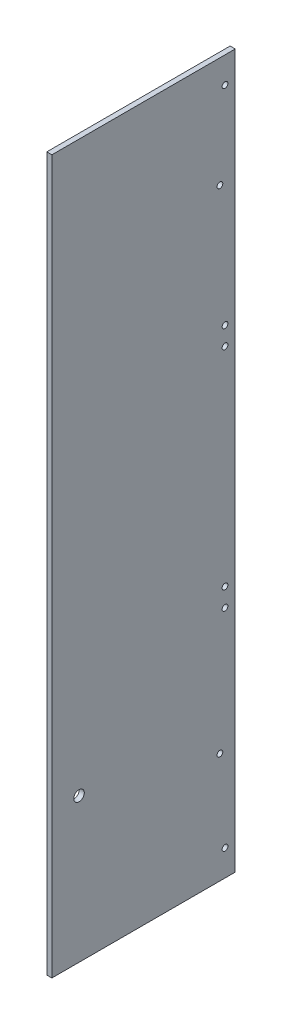
ISO-10303-21;
HEADER;
FILE_DESCRIPTION(('STEP AP214'),'2;1');
FILE_NAME('part.step','',(''),(''),'','','');
FILE_SCHEMA(('AUTOMOTIVE_DESIGN { 1 0 10303 214 1 1 1 1 }'));
ENDSEC;
DATA;
#1=APPLICATION_CONTEXT('core data for automotive mechanical design processes');
#2=APPLICATION_PROTOCOL_DEFINITION('international standard','automotive_design',2000,#1);
#3=PRODUCT_CONTEXT('',#1,'mechanical');
#4=PRODUCT('Part','Part','',(#3));
#5=PRODUCT_RELATED_PRODUCT_CATEGORY('part','',(#4));
#6=PRODUCT_DEFINITION_FORMATION('','',#4);
#7=PRODUCT_DEFINITION_CONTEXT('part definition',#1,'design');
#8=PRODUCT_DEFINITION('design','',#6,#7);
#9=PRODUCT_DEFINITION_SHAPE('','',#8);
#10=(LENGTH_UNIT() NAMED_UNIT(*) SI_UNIT(.MILLI.,.METRE.));
#11=(NAMED_UNIT(*) PLANE_ANGLE_UNIT() SI_UNIT($,.RADIAN.));
#12=(NAMED_UNIT(*) SI_UNIT($,.STERADIAN.) SOLID_ANGLE_UNIT());
#13=UNCERTAINTY_MEASURE_WITH_UNIT(LENGTH_MEASURE(1.E-05),#10,'distance_accuracy_value','');
#14=(GEOMETRIC_REPRESENTATION_CONTEXT(3) GLOBAL_UNCERTAINTY_ASSIGNED_CONTEXT((#13)) GLOBAL_UNIT_ASSIGNED_CONTEXT((#10,
#11,#12)) REPRESENTATION_CONTEXT('',''));
#15=CARTESIAN_POINT('',(0.,0.,0.));
#16=DIRECTION('',(0.,0.,1.));
#17=DIRECTION('',(1.,0.,0.));
#18=AXIS2_PLACEMENT_3D('',#15,#16,#17);
#19=CARTESIAN_POINT('',(0.,0.,108.));
#20=DIRECTION('',(0.,0.,1.));
#21=DIRECTION('',(1.,0.,0.));
#22=AXIS2_PLACEMENT_3D('',#19,#20,#21);
#23=PLANE('',#22);
#24=DIRECTION('',(-1.,0.,0.));
#25=VECTOR('',#24,1.);
#26=CARTESIAN_POINT('',(0.,-210.,108.));
#27=LINE('',#26,#25);
#28=CARTESIAN_POINT('',(1.5,-210.,108.));
#29=VERTEX_POINT('',#28);
#30=CARTESIAN_POINT('',(-1.5,-210.,108.));
#31=VERTEX_POINT('',#30);
#32=EDGE_CURVE('E9',#29,#31,#27,.T.);
#33=ORIENTED_EDGE('',*,*,#32,.F.);
#34=DIRECTION('',(0.,-1.,0.));
#35=VECTOR('',#34,1.);
#36=CARTESIAN_POINT('',(1.5,0.,108.));
#37=LINE('',#36,#35);
#38=CARTESIAN_POINT('',(1.5,210.,108.));
#39=VERTEX_POINT('',#38);
#40=EDGE_CURVE('E61',#39,#29,#37,.T.);
#41=ORIENTED_EDGE('',*,*,#40,.F.);
#42=DIRECTION('',(1.,0.,0.));
#43=VECTOR('',#42,1.);
#44=CARTESIAN_POINT('',(0.,210.,108.));
#45=LINE('',#44,#43);
#46=CARTESIAN_POINT('',(-1.5,210.,108.));
#47=VERTEX_POINT('',#46);
#48=EDGE_CURVE('E89',#47,#39,#45,.T.);
#49=ORIENTED_EDGE('',*,*,#48,.F.);
#50=DIRECTION('',(0.,1.,0.));
#51=VECTOR('',#50,1.);
#52=CARTESIAN_POINT('',(-1.5,0.,108.));
#53=LINE('',#52,#51);
#54=EDGE_CURVE('E23',#31,#47,#53,.T.);
#55=ORIENTED_EDGE('',*,*,#54,.F.);
#56=EDGE_LOOP('',(#33,#41,#49,#55));
#57=FACE_BOUND('',#56,.T.);
#58=ADVANCED_FACE('F15',(#57),#23,.T.);
#59=CARTESIAN_POINT('',(0.,-210.,0.));
#60=DIRECTION('',(0.,-1.,0.));
#61=DIRECTION('',(0.,0.,-1.));
#62=AXIS2_PLACEMENT_3D('',#59,#60,#61);
#63=PLANE('',#62);
#64=DIRECTION('',(0.,0.,1.));
#65=VECTOR('',#64,1.);
#66=CARTESIAN_POINT('',(1.5,-210.,0.));
#67=LINE('',#66,#65);
#68=CARTESIAN_POINT('',(1.5,-210.,0.));
#69=VERTEX_POINT('',#68);
#70=EDGE_CURVE('E54',#69,#29,#67,.T.);
#71=ORIENTED_EDGE('',*,*,#70,.T.);
#72=ORIENTED_EDGE('',*,*,#32,.T.);
#73=DIRECTION('',(0.,0.,1.));
#74=VECTOR('',#73,1.);
#75=CARTESIAN_POINT('',(-1.5,-210.,0.));
#76=LINE('',#75,#74);
#77=CARTESIAN_POINT('',(-1.5,-210.,0.));
#78=VERTEX_POINT('',#77);
#79=EDGE_CURVE('E67',#78,#31,#76,.T.);
#80=ORIENTED_EDGE('',*,*,#79,.F.);
#81=DIRECTION('',(1.,0.,0.));
#82=VECTOR('',#81,1.);
#83=CARTESIAN_POINT('',(0.,-210.,0.));
#84=LINE('',#83,#82);
#85=EDGE_CURVE('E65',#78,#69,#84,.T.);
#86=ORIENTED_EDGE('',*,*,#85,.T.);
#87=EDGE_LOOP('',(#71,#72,#80,#86));
#88=FACE_BOUND('',#87,.T.);
#89=ADVANCED_FACE('F66',(#88),#63,.T.);
#90=CARTESIAN_POINT('',(-1.5,0.,0.));
#91=DIRECTION('',(-1.,0.,0.));
#92=DIRECTION('',(0.,0.,1.));
#93=AXIS2_PLACEMENT_3D('',#90,#91,#92);
#94=PLANE('',#93);
#95=CARTESIAN_POINT('',(-1.5,-125.,92.));
#96=DIRECTION('',(-1.,0.,0.));
#97=DIRECTION('',(0.,0.,1.));
#98=AXIS2_PLACEMENT_3D('',#95,#96,#97);
#99=CIRCLE('',#98,3.1);
#100=CARTESIAN_POINT('',(-1.5,-125.,95.1));
#101=VERTEX_POINT('',#100);
#102=EDGE_CURVE('E121',#101,#101,#99,.T.);
#103=ORIENTED_EDGE('',*,*,#102,.F.);
#104=EDGE_LOOP('',(#103));
#105=FACE_BOUND('',#104,.T.);
#106=CARTESIAN_POINT('',(-1.5,145.,9.));
#107=DIRECTION('',(-1.,0.,0.));
#108=DIRECTION('',(0.,0.,1.));
#109=AXIS2_PLACEMENT_3D('',#106,#107,#108);
#110=CIRCLE('',#109,1.7);
#111=CARTESIAN_POINT('',(-1.5,145.,10.7));
#112=VERTEX_POINT('',#111);
#113=EDGE_CURVE('E118',#112,#112,#110,.T.);
#114=ORIENTED_EDGE('',*,*,#113,.F.);
#115=EDGE_LOOP('',(#114));
#116=FACE_BOUND('',#115,.T.);
#117=CARTESIAN_POINT('',(-1.5,-145.,9.));
#118=DIRECTION('',(-1.,0.,0.));
#119=DIRECTION('',(0.,0.,1.));
#120=AXIS2_PLACEMENT_3D('',#117,#118,#119);
#121=CIRCLE('',#120,1.7);
#122=CARTESIAN_POINT('',(-1.5,-145.,10.7));
#123=VERTEX_POINT('',#122);
#124=EDGE_CURVE('E115',#123,#123,#121,.T.);
#125=ORIENTED_EDGE('',*,*,#124,.F.);
#126=EDGE_LOOP('',(#125));
#127=FACE_BOUND('',#126,.T.);
#128=CARTESIAN_POINT('',(-1.5,194.6,6.));
#129=DIRECTION('',(-1.,0.,0.));
#130=DIRECTION('',(0.,0.,1.));
#131=AXIS2_PLACEMENT_3D('',#128,#129,#130);
#132=CIRCLE('',#131,1.7);
#133=CARTESIAN_POINT('',(-1.5,194.6,7.7));
#134=VERTEX_POINT('',#133);
#135=EDGE_CURVE('E111',#134,#134,#132,.T.);
#136=ORIENTED_EDGE('',*,*,#135,.F.);
#137=EDGE_LOOP('',(#136));
#138=FACE_BOUND('',#137,.T.);
#139=CARTESIAN_POINT('',(-1.5,72.1,6.));
#140=DIRECTION('',(-1.,0.,0.));
#141=DIRECTION('',(0.,0.,1.));
#142=AXIS2_PLACEMENT_3D('',#139,#140,#141);
#143=CIRCLE('',#142,1.7);
#144=CARTESIAN_POINT('',(-1.5,72.1,7.7));
#145=VERTEX_POINT('',#144);
#146=EDGE_CURVE('E107',#145,#145,#143,.T.);
#147=ORIENTED_EDGE('',*,*,#146,.F.);
#148=EDGE_LOOP('',(#147));
#149=FACE_BOUND('',#148,.T.);
#150=CARTESIAN_POINT('',(-1.5,61.25,6.));
#151=DIRECTION('',(-1.,0.,0.));
#152=DIRECTION('',(0.,0.,1.));
#153=AXIS2_PLACEMENT_3D('',#150,#151,#152);
#154=CIRCLE('',#153,1.7);
#155=CARTESIAN_POINT('',(-1.5,61.25,7.7));
#156=VERTEX_POINT('',#155);
#157=EDGE_CURVE('E103',#156,#156,#154,.T.);
#158=ORIENTED_EDGE('',*,*,#157,.F.);
#159=EDGE_LOOP('',(#158));
#160=FACE_BOUND('',#159,.T.);
#161=CARTESIAN_POINT('',(-1.5,-61.25,6.));
#162=DIRECTION('',(-1.,0.,0.));
#163=DIRECTION('',(0.,0.,1.));
#164=AXIS2_PLACEMENT_3D('',#161,#162,#163);
#165=CIRCLE('',#164,1.7);
#166=CARTESIAN_POINT('',(-1.5,-61.25,7.7));
#167=VERTEX_POINT('',#166);
#168=EDGE_CURVE('E99',#167,#167,#165,.T.);
#169=ORIENTED_EDGE('',*,*,#168,.F.);
#170=EDGE_LOOP('',(#169));
#171=FACE_BOUND('',#170,.T.);
#172=CARTESIAN_POINT('',(-1.5,-72.1,6.));
#173=DIRECTION('',(-1.,0.,0.));
#174=DIRECTION('',(0.,0.,1.));
#175=AXIS2_PLACEMENT_3D('',#172,#173,#174);
#176=CIRCLE('',#175,1.7);
#177=CARTESIAN_POINT('',(-1.5,-72.1,7.7));
#178=VERTEX_POINT('',#177);
#179=EDGE_CURVE('E95',#178,#178,#176,.T.);
#180=ORIENTED_EDGE('',*,*,#179,.F.);
#181=EDGE_LOOP('',(#180));
#182=FACE_BOUND('',#181,.T.);
#183=CARTESIAN_POINT('',(-1.5,-194.6,6.));
#184=DIRECTION('',(-1.,0.,0.));
#185=DIRECTION('',(0.,0.,1.));
#186=AXIS2_PLACEMENT_3D('',#183,#184,#185);
#187=CIRCLE('',#186,1.7);
#188=CARTESIAN_POINT('',(-1.5,-194.6,7.7));
#189=VERTEX_POINT('',#188);
#190=EDGE_CURVE('E72',#189,#189,#187,.T.);
#191=ORIENTED_EDGE('',*,*,#190,.F.);
#192=EDGE_LOOP('',(#191));
#193=FACE_BOUND('',#192,.T.);
#194=ORIENTED_EDGE('',*,*,#79,.T.);
#195=ORIENTED_EDGE('',*,*,#54,.T.);
#196=DIRECTION('',(0.,0.,1.));
#197=VECTOR('',#196,1.);
#198=CARTESIAN_POINT('',(-1.5,210.,0.));
#199=LINE('',#198,#197);
#200=CARTESIAN_POINT('',(-1.5,210.,0.));
#201=VERTEX_POINT('',#200);
#202=EDGE_CURVE('E84',#201,#47,#199,.T.);
#203=ORIENTED_EDGE('',*,*,#202,.F.);
#204=DIRECTION('',(0.,-1.,0.));
#205=VECTOR('',#204,1.);
#206=CARTESIAN_POINT('',(-1.5,0.,0.));
#207=LINE('',#206,#205);
#208=EDGE_CURVE('E71',#201,#78,#207,.T.);
#209=ORIENTED_EDGE('',*,*,#208,.T.);
#210=EDGE_LOOP('',(#194,#195,#203,#209));
#211=FACE_BOUND('',#210,.T.);
#212=ADVANCED_FACE('F149',(#105,#116,#127,#138,#149,#160,#171,#182,#193,#211),#94,.T.);
#213=CARTESIAN_POINT('',(0.,210.,0.));
#214=DIRECTION('',(0.,1.,0.));
#215=DIRECTION('',(0.,0.,1.));
#216=AXIS2_PLACEMENT_3D('',#213,#214,#215);
#217=PLANE('',#216);
#218=ORIENTED_EDGE('',*,*,#202,.T.);
#219=ORIENTED_EDGE('',*,*,#48,.T.);
#220=DIRECTION('',(0.,0.,1.));
#221=VECTOR('',#220,1.);
#222=CARTESIAN_POINT('',(1.5,210.,0.));
#223=LINE('',#222,#221);
#224=CARTESIAN_POINT('',(1.5,210.,0.));
#225=VERTEX_POINT('',#224);
#226=EDGE_CURVE('E62',#225,#39,#223,.T.);
#227=ORIENTED_EDGE('',*,*,#226,.F.);
#228=DIRECTION('',(-1.,0.,0.));
#229=VECTOR('',#228,1.);
#230=CARTESIAN_POINT('',(0.,210.,0.));
#231=LINE('',#230,#229);
#232=EDGE_CURVE('E77',#225,#201,#231,.T.);
#233=ORIENTED_EDGE('',*,*,#232,.T.);
#234=EDGE_LOOP('',(#218,#219,#227,#233));
#235=FACE_BOUND('',#234,.T.);
#236=ADVANCED_FACE('F151',(#235),#217,.T.);
#237=CARTESIAN_POINT('',(0.,0.,0.));
#238=DIRECTION('',(0.,0.,-1.));
#239=DIRECTION('',(-1.,0.,0.));
#240=AXIS2_PLACEMENT_3D('',#237,#238,#239);
#241=PLANE('',#240);
#242=DIRECTION('',(0.,1.,0.));
#243=VECTOR('',#242,1.);
#244=CARTESIAN_POINT('',(1.5,0.,0.));
#245=LINE('',#244,#243);
#246=EDGE_CURVE('E59',#69,#225,#245,.T.);
#247=ORIENTED_EDGE('',*,*,#246,.F.);
#248=ORIENTED_EDGE('',*,*,#85,.F.);
#249=ORIENTED_EDGE('',*,*,#208,.F.);
#250=ORIENTED_EDGE('',*,*,#232,.F.);
#251=EDGE_LOOP('',(#247,#248,#249,#250));
#252=FACE_BOUND('',#251,.T.);
#253=ADVANCED_FACE('F75',(#252),#241,.T.);
#254=CARTESIAN_POINT('',(1.5,0.,0.));
#255=DIRECTION('',(1.,0.,0.));
#256=DIRECTION('',(0.,0.,-1.));
#257=AXIS2_PLACEMENT_3D('',#254,#255,#256);
#258=PLANE('',#257);
#259=CARTESIAN_POINT('',(1.5,-125.,92.));
#260=DIRECTION('',(1.,0.,0.));
#261=DIRECTION('',(0.,0.,-1.));
#262=AXIS2_PLACEMENT_3D('',#259,#260,#261);
#263=CIRCLE('',#262,3.1);
#264=CARTESIAN_POINT('',(1.5,-125.,88.9));
#265=VERTEX_POINT('',#264);
#266=EDGE_CURVE('E18',#265,#265,#263,.T.);
#267=ORIENTED_EDGE('',*,*,#266,.F.);
#268=EDGE_LOOP('',(#267));
#269=FACE_BOUND('',#268,.T.);
#270=CARTESIAN_POINT('',(1.5,145.,9.));
#271=DIRECTION('',(1.,0.,0.));
#272=DIRECTION('',(0.,0.,-1.));
#273=AXIS2_PLACEMENT_3D('',#270,#271,#272);
#274=CIRCLE('',#273,1.7);
#275=CARTESIAN_POINT('',(1.5,145.,7.3));
#276=VERTEX_POINT('',#275);
#277=EDGE_CURVE('E119',#276,#276,#274,.T.);
#278=ORIENTED_EDGE('',*,*,#277,.F.);
#279=EDGE_LOOP('',(#278));
#280=FACE_BOUND('',#279,.T.);
#281=CARTESIAN_POINT('',(1.5,-145.,9.));
#282=DIRECTION('',(1.,0.,0.));
#283=DIRECTION('',(0.,0.,-1.));
#284=AXIS2_PLACEMENT_3D('',#281,#282,#283);
#285=CIRCLE('',#284,1.7);
#286=CARTESIAN_POINT('',(1.5,-145.,7.3));
#287=VERTEX_POINT('',#286);
#288=EDGE_CURVE('E116',#287,#287,#285,.T.);
#289=ORIENTED_EDGE('',*,*,#288,.F.);
#290=EDGE_LOOP('',(#289));
#291=FACE_BOUND('',#290,.T.);
#292=CARTESIAN_POINT('',(1.5,194.6,6.));
#293=DIRECTION('',(1.,0.,0.));
#294=DIRECTION('',(0.,0.,-1.));
#295=AXIS2_PLACEMENT_3D('',#292,#293,#294);
#296=CIRCLE('',#295,1.7);
#297=CARTESIAN_POINT('',(1.5,194.6,4.3));
#298=VERTEX_POINT('',#297);
#299=EDGE_CURVE('E112',#298,#298,#296,.T.);
#300=ORIENTED_EDGE('',*,*,#299,.F.);
#301=EDGE_LOOP('',(#300));
#302=FACE_BOUND('',#301,.T.);
#303=CARTESIAN_POINT('',(1.5,72.1,6.));
#304=DIRECTION('',(1.,0.,0.));
#305=DIRECTION('',(0.,0.,-1.));
#306=AXIS2_PLACEMENT_3D('',#303,#304,#305);
#307=CIRCLE('',#306,1.7);
#308=CARTESIAN_POINT('',(1.5,72.1,4.3));
#309=VERTEX_POINT('',#308);
#310=EDGE_CURVE('E108',#309,#309,#307,.T.);
#311=ORIENTED_EDGE('',*,*,#310,.F.);
#312=EDGE_LOOP('',(#311));
#313=FACE_BOUND('',#312,.T.);
#314=CARTESIAN_POINT('',(1.5,61.25,6.));
#315=DIRECTION('',(1.,0.,0.));
#316=DIRECTION('',(0.,0.,-1.));
#317=AXIS2_PLACEMENT_3D('',#314,#315,#316);
#318=CIRCLE('',#317,1.7);
#319=CARTESIAN_POINT('',(1.5,61.25,4.3));
#320=VERTEX_POINT('',#319);
#321=EDGE_CURVE('E104',#320,#320,#318,.T.);
#322=ORIENTED_EDGE('',*,*,#321,.F.);
#323=EDGE_LOOP('',(#322));
#324=FACE_BOUND('',#323,.T.);
#325=CARTESIAN_POINT('',(1.5,-61.25,6.));
#326=DIRECTION('',(1.,0.,0.));
#327=DIRECTION('',(0.,0.,-1.));
#328=AXIS2_PLACEMENT_3D('',#325,#326,#327);
#329=CIRCLE('',#328,1.7);
#330=CARTESIAN_POINT('',(1.5,-61.25,4.3));
#331=VERTEX_POINT('',#330);
#332=EDGE_CURVE('E100',#331,#331,#329,.T.);
#333=ORIENTED_EDGE('',*,*,#332,.F.);
#334=EDGE_LOOP('',(#333));
#335=FACE_BOUND('',#334,.T.);
#336=CARTESIAN_POINT('',(1.5,-72.1,6.));
#337=DIRECTION('',(1.,0.,0.));
#338=DIRECTION('',(0.,0.,-1.));
#339=AXIS2_PLACEMENT_3D('',#336,#337,#338);
#340=CIRCLE('',#339,1.7);
#341=CARTESIAN_POINT('',(1.5,-72.1,4.3));
#342=VERTEX_POINT('',#341);
#343=EDGE_CURVE('E96',#342,#342,#340,.T.);
#344=ORIENTED_EDGE('',*,*,#343,.F.);
#345=EDGE_LOOP('',(#344));
#346=FACE_BOUND('',#345,.T.);
#347=CARTESIAN_POINT('',(1.5,-194.6,6.));
#348=DIRECTION('',(1.,0.,0.));
#349=DIRECTION('',(0.,0.,-1.));
#350=AXIS2_PLACEMENT_3D('',#347,#348,#349);
#351=CIRCLE('',#350,1.7);
#352=CARTESIAN_POINT('',(1.5,-194.6,4.3));
#353=VERTEX_POINT('',#352);
#354=EDGE_CURVE('E92',#353,#353,#351,.T.);
#355=ORIENTED_EDGE('',*,*,#354,.F.);
#356=EDGE_LOOP('',(#355));
#357=FACE_BOUND('',#356,.T.);
#358=ORIENTED_EDGE('',*,*,#246,.T.);
#359=ORIENTED_EDGE('',*,*,#226,.T.);
#360=ORIENTED_EDGE('',*,*,#40,.T.);
#361=ORIENTED_EDGE('',*,*,#70,.F.);
#362=EDGE_LOOP('',(#358,#359,#360,#361));
#363=FACE_BOUND('',#362,.T.);
#364=ADVANCED_FACE('F56',(#269,#280,#291,#302,#313,#324,#335,#346,#357,#363),#258,.T.);
#365=CARTESIAN_POINT('',(-1.9,-194.6,6.));
#366=DIRECTION('',(1.,0.,0.));
#367=DIRECTION('',(0.,0.,-1.));
#368=AXIS2_PLACEMENT_3D('',#365,#366,#367);
#369=CYLINDRICAL_SURFACE('',#368,1.7);
#370=ORIENTED_EDGE('',*,*,#190,.T.);
#371=EDGE_LOOP('',(#370));
#372=FACE_BOUND('',#371,.T.);
#373=ORIENTED_EDGE('',*,*,#354,.T.);
#374=EDGE_LOOP('',(#373));
#375=FACE_BOUND('',#374,.T.);
#376=ADVANCED_FACE('F146',(#372,#375),#369,.F.);
#377=CARTESIAN_POINT('',(-1.9,-72.1,6.));
#378=DIRECTION('',(1.,0.,0.));
#379=DIRECTION('',(0.,0.,-1.));
#380=AXIS2_PLACEMENT_3D('',#377,#378,#379);
#381=CYLINDRICAL_SURFACE('',#380,1.7);
#382=ORIENTED_EDGE('',*,*,#179,.T.);
#383=EDGE_LOOP('',(#382));
#384=FACE_BOUND('',#383,.T.);
#385=ORIENTED_EDGE('',*,*,#343,.T.);
#386=EDGE_LOOP('',(#385));
#387=FACE_BOUND('',#386,.T.);
#388=ADVANCED_FACE('F173',(#384,#387),#381,.F.);
#389=CARTESIAN_POINT('',(-1.9,-61.25,6.));
#390=DIRECTION('',(1.,0.,0.));
#391=DIRECTION('',(0.,0.,-1.));
#392=AXIS2_PLACEMENT_3D('',#389,#390,#391);
#393=CYLINDRICAL_SURFACE('',#392,1.7);
#394=ORIENTED_EDGE('',*,*,#168,.T.);
#395=EDGE_LOOP('',(#394));
#396=FACE_BOUND('',#395,.T.);
#397=ORIENTED_EDGE('',*,*,#332,.T.);
#398=EDGE_LOOP('',(#397));
#399=FACE_BOUND('',#398,.T.);
#400=ADVANCED_FACE('F176',(#396,#399),#393,.F.);
#401=CARTESIAN_POINT('',(-1.9,61.25,6.));
#402=DIRECTION('',(1.,0.,0.));
#403=DIRECTION('',(0.,0.,-1.));
#404=AXIS2_PLACEMENT_3D('',#401,#402,#403);
#405=CYLINDRICAL_SURFACE('',#404,1.7);
#406=ORIENTED_EDGE('',*,*,#157,.T.);
#407=EDGE_LOOP('',(#406));
#408=FACE_BOUND('',#407,.T.);
#409=ORIENTED_EDGE('',*,*,#321,.T.);
#410=EDGE_LOOP('',(#409));
#411=FACE_BOUND('',#410,.T.);
#412=ADVANCED_FACE('F180',(#408,#411),#405,.F.);
#413=CARTESIAN_POINT('',(-1.9,72.1,6.));
#414=DIRECTION('',(1.,0.,0.));
#415=DIRECTION('',(0.,0.,-1.));
#416=AXIS2_PLACEMENT_3D('',#413,#414,#415);
#417=CYLINDRICAL_SURFACE('',#416,1.7);
#418=ORIENTED_EDGE('',*,*,#146,.T.);
#419=EDGE_LOOP('',(#418));
#420=FACE_BOUND('',#419,.T.);
#421=ORIENTED_EDGE('',*,*,#310,.T.);
#422=EDGE_LOOP('',(#421));
#423=FACE_BOUND('',#422,.T.);
#424=ADVANCED_FACE('F184',(#420,#423),#417,.F.);
#425=CARTESIAN_POINT('',(-1.9,194.6,6.));
#426=DIRECTION('',(1.,0.,0.));
#427=DIRECTION('',(0.,0.,-1.));
#428=AXIS2_PLACEMENT_3D('',#425,#426,#427);
#429=CYLINDRICAL_SURFACE('',#428,1.7);
#430=ORIENTED_EDGE('',*,*,#135,.T.);
#431=EDGE_LOOP('',(#430));
#432=FACE_BOUND('',#431,.T.);
#433=ORIENTED_EDGE('',*,*,#299,.T.);
#434=EDGE_LOOP('',(#433));
#435=FACE_BOUND('',#434,.T.);
#436=ADVANCED_FACE('F188',(#432,#435),#429,.F.);
#437=CARTESIAN_POINT('',(-1.9,-145.,9.));
#438=DIRECTION('',(1.,0.,0.));
#439=DIRECTION('',(0.,0.,-1.));
#440=AXIS2_PLACEMENT_3D('',#437,#438,#439);
#441=CYLINDRICAL_SURFACE('',#440,1.7);
#442=ORIENTED_EDGE('',*,*,#124,.T.);
#443=EDGE_LOOP('',(#442));
#444=FACE_BOUND('',#443,.T.);
#445=ORIENTED_EDGE('',*,*,#288,.T.);
#446=EDGE_LOOP('',(#445));
#447=FACE_BOUND('',#446,.T.);
#448=ADVANCED_FACE('F192',(#444,#447),#441,.F.);
#449=CARTESIAN_POINT('',(-1.9,145.,9.));
#450=DIRECTION('',(1.,0.,0.));
#451=DIRECTION('',(0.,0.,-1.));
#452=AXIS2_PLACEMENT_3D('',#449,#450,#451);
#453=CYLINDRICAL_SURFACE('',#452,1.7);
#454=ORIENTED_EDGE('',*,*,#113,.T.);
#455=EDGE_LOOP('',(#454));
#456=FACE_BOUND('',#455,.T.);
#457=ORIENTED_EDGE('',*,*,#277,.T.);
#458=EDGE_LOOP('',(#457));
#459=FACE_BOUND('',#458,.T.);
#460=ADVANCED_FACE('F196',(#456,#459),#453,.F.);
#461=CARTESIAN_POINT('',(-1.9,-125.,92.));
#462=DIRECTION('',(1.,0.,0.));
#463=DIRECTION('',(0.,0.,-1.));
#464=AXIS2_PLACEMENT_3D('',#461,#462,#463);
#465=CYLINDRICAL_SURFACE('',#464,3.1);
#466=ORIENTED_EDGE('',*,*,#102,.T.);
#467=EDGE_LOOP('',(#466));
#468=FACE_BOUND('',#467,.T.);
#469=ORIENTED_EDGE('',*,*,#266,.T.);
#470=EDGE_LOOP('',(#469));
#471=FACE_BOUND('',#470,.T.);
#472=ADVANCED_FACE('F200',(#468,#471),#465,.F.);
#473=CLOSED_SHELL('',(#58,#89,#212,#236,#253,#364,#376,#388,#400,#412,#424,#436,#448,#460,#472));
#474=MANIFOLD_SOLID_BREP('B1',#473);
#475=ADVANCED_BREP_SHAPE_REPRESENTATION('',(#18,#474),#14);
#476=SHAPE_DEFINITION_REPRESENTATION(#9,#475);
ENDSEC;
END-ISO-10303-21;
